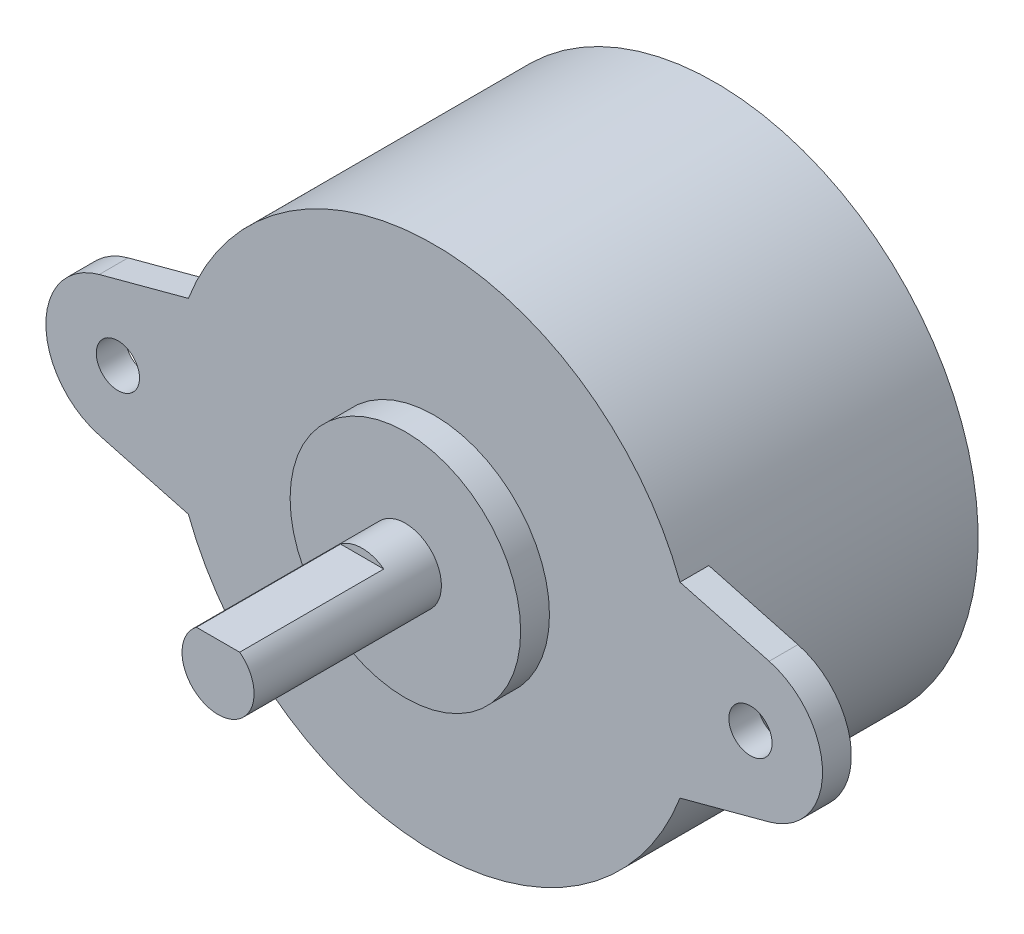
ISO-10303-21;
HEADER;
FILE_DESCRIPTION(('STEP AP214'),'2;1');
FILE_NAME('part.step','',(''),(''),'','','');
FILE_SCHEMA(('AUTOMOTIVE_DESIGN { 1 0 10303 214 1 1 1 1 }'));
ENDSEC;
DATA;
#1=APPLICATION_CONTEXT('core data for automotive mechanical design processes');
#2=APPLICATION_PROTOCOL_DEFINITION('international standard','automotive_design',2000,#1);
#3=PRODUCT_CONTEXT('',#1,'mechanical');
#4=PRODUCT('Part','Part','',(#3));
#5=PRODUCT_RELATED_PRODUCT_CATEGORY('part','',(#4));
#6=PRODUCT_DEFINITION_FORMATION('','',#4);
#7=PRODUCT_DEFINITION_CONTEXT('part definition',#1,'design');
#8=PRODUCT_DEFINITION('design','',#6,#7);
#9=PRODUCT_DEFINITION_SHAPE('','',#8);
#10=(LENGTH_UNIT() NAMED_UNIT(*) SI_UNIT(.MILLI.,.METRE.));
#11=(NAMED_UNIT(*) PLANE_ANGLE_UNIT() SI_UNIT($,.RADIAN.));
#12=(NAMED_UNIT(*) SI_UNIT($,.STERADIAN.) SOLID_ANGLE_UNIT());
#13=UNCERTAINTY_MEASURE_WITH_UNIT(LENGTH_MEASURE(1.E-05),#10,'distance_accuracy_value','');
#14=(GEOMETRIC_REPRESENTATION_CONTEXT(3) GLOBAL_UNCERTAINTY_ASSIGNED_CONTEXT((#13)) GLOBAL_UNIT_ASSIGNED_CONTEXT((#10,
#11,#12)) REPRESENTATION_CONTEXT('',''));
#15=CARTESIAN_POINT('',(0.,0.,0.));
#16=DIRECTION('',(0.,0.,1.));
#17=DIRECTION('',(1.,0.,0.));
#18=AXIS2_PLACEMENT_3D('',#15,#16,#17);
#19=CARTESIAN_POINT('',(0.,0.,-2.));
#20=DIRECTION('',(0.,0.,1.));
#21=DIRECTION('',(1.,0.,0.));
#22=AXIS2_PLACEMENT_3D('',#19,#20,#21);
#23=PLANE('',#22);
#24=CARTESIAN_POINT('',(0.,0.,-2.));
#25=DIRECTION('',(0.,0.,-1.));
#26=DIRECTION('',(-1.,0.,0.));
#27=AXIS2_PLACEMENT_3D('',#24,#25,#26);
#28=CIRCLE('',#27,18.25);
#29=CARTESIAN_POINT('',(17.058114991301,6.4871575395972,-2.));
#30=VERTEX_POINT('',#29);
#31=CARTESIAN_POINT('',(17.058114991301,-6.48715753959718,-2.));
#32=VERTEX_POINT('',#31);
#33=EDGE_CURVE('E41',#30,#32,#28,.T.);
#34=ORIENTED_EDGE('',*,*,#33,.F.);
#35=DIRECTION('',(-0.96592582628907,0.258819045102514,0.));
#36=VECTOR('',#35,1.);
#37=CARTESIAN_POINT('',(23.2440952255126,4.82962913144536,-2.));
#38=LINE('',#37,#36);
#39=CARTESIAN_POINT('',(23.2440952255126,4.82962913144536,-2.));
#40=VERTEX_POINT('',#39);
#41=EDGE_CURVE('E135',#40,#30,#38,.T.);
#42=ORIENTED_EDGE('',*,*,#41,.F.);
#43=CARTESIAN_POINT('',(21.95,0.,-2.));
#44=DIRECTION('',(0.,0.,1.));
#45=DIRECTION('',(1.,0.,0.));
#46=AXIS2_PLACEMENT_3D('',#43,#44,#45);
#47=CIRCLE('',#46,5.);
#48=CARTESIAN_POINT('',(23.2440952255126,-4.82962913144534,-2.));
#49=VERTEX_POINT('',#48);
#50=EDGE_CURVE('E138',#49,#40,#47,.T.);
#51=ORIENTED_EDGE('',*,*,#50,.F.);
#52=DIRECTION('',(0.96592582628907,0.258819045102515,0.));
#53=VECTOR('',#52,1.);
#54=CARTESIAN_POINT('',(23.2440952255126,-4.82962913144534,-2.));
#55=LINE('',#54,#53);
#56=EDGE_CURVE('E165',#32,#49,#55,.T.);
#57=ORIENTED_EDGE('',*,*,#56,.F.);
#58=EDGE_LOOP('',(#34,#42,#51,#57));
#59=FACE_BOUND('',#58,.T.);
#60=CARTESIAN_POINT('',(21.95,0.,-2.));
#61=DIRECTION('',(0.,0.,1.));
#62=DIRECTION('',(1.,0.,0.));
#63=AXIS2_PLACEMENT_3D('',#60,#61,#62);
#64=CIRCLE('',#63,1.5);
#65=CARTESIAN_POINT('',(23.45,0.,-2.));
#66=VERTEX_POINT('',#65);
#67=EDGE_CURVE('E217',#66,#66,#64,.T.);
#68=ORIENTED_EDGE('',*,*,#67,.T.);
#69=EDGE_LOOP('',(#68));
#70=FACE_BOUND('',#69,.T.);
#71=ADVANCED_FACE('F32',(#59,#70),#23,.F.);
#72=CARTESIAN_POINT('',(-23.2440952255126,-4.82962913144534,-2.));
#73=DIRECTION('',(-0.258819045102521,-0.965925826289068,0.));
#74=DIRECTION('',(0.965925826289068,-0.258819045102521,0.));
#75=AXIS2_PLACEMENT_3D('',#72,#73,#74);
#76=PLANE('',#75);
#77=DIRECTION('',(0.965925826289068,-0.258819045102521,0.));
#78=VECTOR('',#77,1.);
#79=CARTESIAN_POINT('',(-23.2440952255126,-4.82962913144534,0.));
#80=LINE('',#79,#78);
#81=CARTESIAN_POINT('',(-23.2440952255126,-4.82962913144534,0.));
#82=VERTEX_POINT('',#81);
#83=CARTESIAN_POINT('',(-17.058114991301,-6.48715753959724,0.));
#84=VERTEX_POINT('',#83);
#85=EDGE_CURVE('E162',#82,#84,#80,.T.);
#86=ORIENTED_EDGE('',*,*,#85,.F.);
#87=DIRECTION('',(0.,0.,1.));
#88=VECTOR('',#87,1.);
#89=CARTESIAN_POINT('',(-23.2440952255126,-4.82962913144534,-2.));
#90=LINE('',#89,#88);
#91=CARTESIAN_POINT('',(-23.2440952255126,-4.82962913144534,-2.));
#92=VERTEX_POINT('',#91);
#93=EDGE_CURVE('E125',#92,#82,#90,.T.);
#94=ORIENTED_EDGE('',*,*,#93,.F.);
#95=DIRECTION('',(0.965925826289068,-0.258819045102521,0.));
#96=VECTOR('',#95,1.);
#97=CARTESIAN_POINT('',(-23.2440952255126,-4.82962913144534,-2.));
#98=LINE('',#97,#96);
#99=CARTESIAN_POINT('',(-17.058114991301,-6.48715753959724,-2.));
#100=VERTEX_POINT('',#99);
#101=EDGE_CURVE('E132',#92,#100,#98,.T.);
#102=ORIENTED_EDGE('',*,*,#101,.T.);
#103=DIRECTION('',(0.,0.,1.));
#104=VECTOR('',#103,1.);
#105=CARTESIAN_POINT('',(-17.058114991301,-6.48715753959724,-2.));
#106=LINE('',#105,#104);
#107=EDGE_CURVE('E92',#100,#84,#106,.T.);
#108=ORIENTED_EDGE('',*,*,#107,.T.);
#109=EDGE_LOOP('',(#86,#94,#102,#108));
#110=FACE_BOUND('',#109,.T.);
#111=ADVANCED_FACE('F182',(#110),#76,.T.);
#112=CARTESIAN_POINT('',(-21.95,0.,-2.));
#113=DIRECTION('',(0.,0.,1.));
#114=DIRECTION('',(1.,0.,0.));
#115=AXIS2_PLACEMENT_3D('',#112,#113,#114);
#116=CYLINDRICAL_SURFACE('',#115,5.);
#117=CARTESIAN_POINT('',(-21.95,0.,0.));
#118=DIRECTION('',(0.,0.,1.));
#119=DIRECTION('',(1.,0.,0.));
#120=AXIS2_PLACEMENT_3D('',#117,#118,#119);
#121=CIRCLE('',#120,5.);
#122=CARTESIAN_POINT('',(-23.2440952255126,4.82962913144534,0.));
#123=VERTEX_POINT('',#122);
#124=EDGE_CURVE('E120',#123,#82,#121,.T.);
#125=ORIENTED_EDGE('',*,*,#124,.F.);
#126=DIRECTION('',(0.,0.,1.));
#127=VECTOR('',#126,1.);
#128=CARTESIAN_POINT('',(-23.2440952255126,4.82962913144534,-2.));
#129=LINE('',#128,#127);
#130=CARTESIAN_POINT('',(-23.2440952255126,4.82962913144534,-2.));
#131=VERTEX_POINT('',#130);
#132=EDGE_CURVE('E115',#131,#123,#129,.T.);
#133=ORIENTED_EDGE('',*,*,#132,.F.);
#134=CARTESIAN_POINT('',(-21.95,0.,-2.));
#135=DIRECTION('',(0.,0.,1.));
#136=DIRECTION('',(1.,0.,0.));
#137=AXIS2_PLACEMENT_3D('',#134,#135,#136);
#138=CIRCLE('',#137,5.);
#139=EDGE_CURVE('E118',#131,#92,#138,.T.);
#140=ORIENTED_EDGE('',*,*,#139,.T.);
#141=ORIENTED_EDGE('',*,*,#93,.T.);
#142=EDGE_LOOP('',(#125,#133,#140,#141));
#143=FACE_BOUND('',#142,.T.);
#144=ADVANCED_FACE('F117',(#143),#116,.T.);
#145=CARTESIAN_POINT('',(-23.2440952255126,4.82962913144534,-2.));
#146=DIRECTION('',(-0.258819045102522,0.965925826289068,0.));
#147=DIRECTION('',(-0.965925826289068,-0.258819045102522,0.));
#148=AXIS2_PLACEMENT_3D('',#145,#146,#147);
#149=PLANE('',#148);
#150=DIRECTION('',(-0.965925826289068,-0.258819045102522,0.));
#151=VECTOR('',#150,1.);
#152=CARTESIAN_POINT('',(-23.2440952255126,4.82962913144534,0.));
#153=LINE('',#152,#151);
#154=CARTESIAN_POINT('',(-17.058114991301,6.48715753959725,0.));
#155=VERTEX_POINT('',#154);
#156=EDGE_CURVE('E159',#155,#123,#153,.T.);
#157=ORIENTED_EDGE('',*,*,#156,.F.);
#158=DIRECTION('',(0.,0.,1.));
#159=VECTOR('',#158,1.);
#160=CARTESIAN_POINT('',(-17.058114991301,6.48715753959725,-2.));
#161=LINE('',#160,#159);
#162=CARTESIAN_POINT('',(-17.058114991301,6.48715753959724,-2.));
#163=VERTEX_POINT('',#162);
#164=EDGE_CURVE('E126',#163,#155,#161,.T.);
#165=ORIENTED_EDGE('',*,*,#164,.F.);
#166=DIRECTION('',(-0.965925826289068,-0.258819045102522,0.));
#167=VECTOR('',#166,1.);
#168=CARTESIAN_POINT('',(-23.2440952255126,4.82962913144534,-2.));
#169=LINE('',#168,#167);
#170=EDGE_CURVE('E130',#163,#131,#169,.T.);
#171=ORIENTED_EDGE('',*,*,#170,.T.);
#172=ORIENTED_EDGE('',*,*,#132,.T.);
#173=EDGE_LOOP('',(#157,#165,#171,#172));
#174=FACE_BOUND('',#173,.T.);
#175=ADVANCED_FACE('F134',(#174),#149,.T.);
#176=CARTESIAN_POINT('',(0.,0.,-2.));
#177=DIRECTION('',(0.,0.,1.));
#178=DIRECTION('',(1.,0.,0.));
#179=AXIS2_PLACEMENT_3D('',#176,#177,#178);
#180=CYLINDRICAL_SURFACE('',#179,18.25);
#181=CARTESIAN_POINT('',(0.,0.,0.));
#182=DIRECTION('',(0.,0.,1.));
#183=DIRECTION('',(1.,0.,0.));
#184=AXIS2_PLACEMENT_3D('',#181,#182,#183);
#185=CIRCLE('',#184,18.25);
#186=CARTESIAN_POINT('',(17.058114991301,6.4871575395972,0.));
#187=VERTEX_POINT('',#186);
#188=EDGE_CURVE('E156',#187,#155,#185,.T.);
#189=ORIENTED_EDGE('',*,*,#188,.F.);
#190=DIRECTION('',(0.,0.,1.));
#191=VECTOR('',#190,1.);
#192=CARTESIAN_POINT('',(17.058114991301,6.4871575395972,-2.));
#193=LINE('',#192,#191);
#194=EDGE_CURVE('E169',#30,#187,#193,.T.);
#195=ORIENTED_EDGE('',*,*,#194,.F.);
#196=ORIENTED_EDGE('',*,*,#33,.T.);
#197=DIRECTION('',(0.,0.,1.));
#198=VECTOR('',#197,1.);
#199=CARTESIAN_POINT('',(17.058114991301,-6.48715753959718,-2.));
#200=LINE('',#199,#198);
#201=CARTESIAN_POINT('',(17.058114991301,-6.48715753959718,0.));
#202=VERTEX_POINT('',#201);
#203=EDGE_CURVE('E36',#32,#202,#200,.T.);
#204=ORIENTED_EDGE('',*,*,#203,.T.);
#205=CARTESIAN_POINT('',(0.,0.,0.));
#206=DIRECTION('',(0.,0.,1.));
#207=DIRECTION('',(1.,0.,0.));
#208=AXIS2_PLACEMENT_3D('',#205,#206,#207);
#209=CIRCLE('',#208,18.25);
#210=EDGE_CURVE('E143',#84,#202,#209,.T.);
#211=ORIENTED_EDGE('',*,*,#210,.F.);
#212=ORIENTED_EDGE('',*,*,#107,.F.);
#213=EDGE_CURVE('E58',#100,#163,#28,.T.);
#214=ORIENTED_EDGE('',*,*,#213,.T.);
#215=ORIENTED_EDGE('',*,*,#164,.T.);
#216=EDGE_LOOP('',(#189,#195,#196,#204,#211,#212,#214,#215));
#217=FACE_BOUND('',#216,.T.);
#218=CARTESIAN_POINT('',(0.,0.,-19.5));
#219=DIRECTION('',(0.,0.,-1.));
#220=DIRECTION('',(-1.,0.,0.));
#221=AXIS2_PLACEMENT_3D('',#218,#219,#220);
#222=CIRCLE('',#221,18.25);
#223=CARTESIAN_POINT('',(-18.25,0.,-19.5));
#224=VERTEX_POINT('',#223);
#225=EDGE_CURVE('E215',#224,#224,#222,.T.);
#226=ORIENTED_EDGE('',*,*,#225,.F.);
#227=EDGE_LOOP('',(#226));
#228=FACE_BOUND('',#227,.T.);
#229=ADVANCED_FACE('F177',(#217,#228),#180,.T.);
#230=CARTESIAN_POINT('',(23.2440952255126,4.82962913144536,-2.));
#231=DIRECTION('',(0.258819045102514,0.96592582628907,0.));
#232=DIRECTION('',(-0.96592582628907,0.258819045102514,0.));
#233=AXIS2_PLACEMENT_3D('',#230,#231,#232);
#234=PLANE('',#233);
#235=DIRECTION('',(-0.96592582628907,0.258819045102514,0.));
#236=VECTOR('',#235,1.);
#237=CARTESIAN_POINT('',(23.2440952255126,4.82962913144536,0.));
#238=LINE('',#237,#236);
#239=CARTESIAN_POINT('',(23.2440952255126,4.82962913144536,0.));
#240=VERTEX_POINT('',#239);
#241=EDGE_CURVE('E153',#240,#187,#238,.T.);
#242=ORIENTED_EDGE('',*,*,#241,.F.);
#243=DIRECTION('',(0.,0.,1.));
#244=VECTOR('',#243,1.);
#245=CARTESIAN_POINT('',(23.2440952255126,4.82962913144536,-2.));
#246=LINE('',#245,#244);
#247=EDGE_CURVE('E171',#40,#240,#246,.T.);
#248=ORIENTED_EDGE('',*,*,#247,.F.);
#249=ORIENTED_EDGE('',*,*,#41,.T.);
#250=ORIENTED_EDGE('',*,*,#194,.T.);
#251=EDGE_LOOP('',(#242,#248,#249,#250));
#252=FACE_BOUND('',#251,.T.);
#253=ADVANCED_FACE('F198',(#252),#234,.T.);
#254=CARTESIAN_POINT('',(21.95,0.,-2.));
#255=DIRECTION('',(0.,0.,1.));
#256=DIRECTION('',(1.,0.,0.));
#257=AXIS2_PLACEMENT_3D('',#254,#255,#256);
#258=CYLINDRICAL_SURFACE('',#257,5.);
#259=CARTESIAN_POINT('',(21.95,0.,0.));
#260=DIRECTION('',(0.,0.,1.));
#261=DIRECTION('',(1.,0.,0.));
#262=AXIS2_PLACEMENT_3D('',#259,#260,#261);
#263=CIRCLE('',#262,5.);
#264=CARTESIAN_POINT('',(23.2440952255126,-4.82962913144534,0.));
#265=VERTEX_POINT('',#264);
#266=EDGE_CURVE('E150',#265,#240,#263,.T.);
#267=ORIENTED_EDGE('',*,*,#266,.F.);
#268=DIRECTION('',(0.,0.,1.));
#269=VECTOR('',#268,1.);
#270=CARTESIAN_POINT('',(23.2440952255126,-4.82962913144534,-2.));
#271=LINE('',#270,#269);
#272=EDGE_CURVE('E172',#49,#265,#271,.T.);
#273=ORIENTED_EDGE('',*,*,#272,.F.);
#274=ORIENTED_EDGE('',*,*,#50,.T.);
#275=ORIENTED_EDGE('',*,*,#247,.T.);
#276=EDGE_LOOP('',(#267,#273,#274,#275));
#277=FACE_BOUND('',#276,.T.);
#278=ADVANCED_FACE('F200',(#277),#258,.T.);
#279=CARTESIAN_POINT('',(23.2440952255126,-4.82962913144534,-2.));
#280=DIRECTION('',(0.258819045102515,-0.96592582628907,0.));
#281=DIRECTION('',(0.96592582628907,0.258819045102515,0.));
#282=AXIS2_PLACEMENT_3D('',#279,#280,#281);
#283=PLANE('',#282);
#284=DIRECTION('',(0.96592582628907,0.258819045102515,0.));
#285=VECTOR('',#284,1.);
#286=CARTESIAN_POINT('',(23.2440952255126,-4.82962913144534,0.));
#287=LINE('',#286,#285);
#288=EDGE_CURVE('E146',#202,#265,#287,.T.);
#289=ORIENTED_EDGE('',*,*,#288,.F.);
#290=ORIENTED_EDGE('',*,*,#203,.F.);
#291=ORIENTED_EDGE('',*,*,#56,.T.);
#292=ORIENTED_EDGE('',*,*,#272,.T.);
#293=EDGE_LOOP('',(#289,#290,#291,#292));
#294=FACE_BOUND('',#293,.T.);
#295=ADVANCED_FACE('F34',(#294),#283,.T.);
#296=ORIENTED_EDGE('',*,*,#213,.F.);
#297=ORIENTED_EDGE('',*,*,#101,.F.);
#298=ORIENTED_EDGE('',*,*,#139,.F.);
#299=ORIENTED_EDGE('',*,*,#170,.F.);
#300=EDGE_LOOP('',(#296,#297,#298,#299));
#301=FACE_BOUND('',#300,.T.);
#302=CARTESIAN_POINT('',(-21.95,0.,-2.));
#303=DIRECTION('',(0.,0.,1.));
#304=DIRECTION('',(1.,0.,0.));
#305=AXIS2_PLACEMENT_3D('',#302,#303,#304);
#306=CIRCLE('',#305,1.5);
#307=CARTESIAN_POINT('',(-20.45,0.,-2.));
#308=VERTEX_POINT('',#307);
#309=EDGE_CURVE('E147',#308,#308,#306,.T.);
#310=ORIENTED_EDGE('',*,*,#309,.T.);
#311=EDGE_LOOP('',(#310));
#312=FACE_BOUND('',#311,.T.);
#313=ADVANCED_FACE('F128',(#301,#312),#23,.F.);
#314=CARTESIAN_POINT('',(0.,0.,0.));
#315=DIRECTION('',(0.,0.,1.));
#316=DIRECTION('',(1.,0.,0.));
#317=AXIS2_PLACEMENT_3D('',#314,#315,#316);
#318=PLANE('',#317);
#319=CARTESIAN_POINT('',(0.,0.,0.));
#320=DIRECTION('',(0.,0.,1.));
#321=DIRECTION('',(1.,0.,0.));
#322=AXIS2_PLACEMENT_3D('',#319,#320,#321);
#323=CIRCLE('',#322,8.);
#324=CARTESIAN_POINT('',(8.,0.,0.));
#325=VERTEX_POINT('',#324);
#326=EDGE_CURVE('E335',#325,#325,#323,.T.);
#327=ORIENTED_EDGE('',*,*,#326,.F.);
#328=EDGE_LOOP('',(#327));
#329=FACE_BOUND('',#328,.T.);
#330=CARTESIAN_POINT('',(21.95,0.,0.));
#331=DIRECTION('',(0.,0.,1.));
#332=DIRECTION('',(1.,0.,0.));
#333=AXIS2_PLACEMENT_3D('',#330,#331,#332);
#334=CIRCLE('',#333,1.5);
#335=CARTESIAN_POINT('',(23.45,0.,0.));
#336=VERTEX_POINT('',#335);
#337=EDGE_CURVE('E221',#336,#336,#334,.T.);
#338=ORIENTED_EDGE('',*,*,#337,.F.);
#339=EDGE_LOOP('',(#338));
#340=FACE_BOUND('',#339,.T.);
#341=CARTESIAN_POINT('',(-21.95,0.,0.));
#342=DIRECTION('',(0.,0.,1.));
#343=DIRECTION('',(1.,0.,0.));
#344=AXIS2_PLACEMENT_3D('',#341,#342,#343);
#345=CIRCLE('',#344,1.5);
#346=CARTESIAN_POINT('',(-20.45,0.,0.));
#347=VERTEX_POINT('',#346);
#348=EDGE_CURVE('E220',#347,#347,#345,.T.);
#349=ORIENTED_EDGE('',*,*,#348,.F.);
#350=EDGE_LOOP('',(#349));
#351=FACE_BOUND('',#350,.T.);
#352=ORIENTED_EDGE('',*,*,#210,.T.);
#353=ORIENTED_EDGE('',*,*,#288,.T.);
#354=ORIENTED_EDGE('',*,*,#266,.T.);
#355=ORIENTED_EDGE('',*,*,#241,.T.);
#356=ORIENTED_EDGE('',*,*,#188,.T.);
#357=ORIENTED_EDGE('',*,*,#156,.T.);
#358=ORIENTED_EDGE('',*,*,#124,.T.);
#359=ORIENTED_EDGE('',*,*,#85,.T.);
#360=EDGE_LOOP('',(#352,#353,#354,#355,#356,#357,#358,#359));
#361=FACE_BOUND('',#360,.T.);
#362=ADVANCED_FACE('F181',(#329,#340,#351,#361),#318,.T.);
#363=CARTESIAN_POINT('',(-21.95,0.,-2.));
#364=DIRECTION('',(0.,0.,1.));
#365=DIRECTION('',(1.,0.,0.));
#366=AXIS2_PLACEMENT_3D('',#363,#364,#365);
#367=CYLINDRICAL_SURFACE('',#366,1.5);
#368=ORIENTED_EDGE('',*,*,#309,.F.);
#369=EDGE_LOOP('',(#368));
#370=FACE_BOUND('',#369,.T.);
#371=ORIENTED_EDGE('',*,*,#348,.T.);
#372=EDGE_LOOP('',(#371));
#373=FACE_BOUND('',#372,.T.);
#374=ADVANCED_FACE('F235',(#370,#373),#367,.F.);
#375=CARTESIAN_POINT('',(21.95,0.,-2.));
#376=DIRECTION('',(0.,0.,1.));
#377=DIRECTION('',(1.,0.,0.));
#378=AXIS2_PLACEMENT_3D('',#375,#376,#377);
#379=CYLINDRICAL_SURFACE('',#378,1.5);
#380=ORIENTED_EDGE('',*,*,#67,.F.);
#381=EDGE_LOOP('',(#380));
#382=FACE_BOUND('',#381,.T.);
#383=ORIENTED_EDGE('',*,*,#337,.T.);
#384=EDGE_LOOP('',(#383));
#385=FACE_BOUND('',#384,.T.);
#386=ADVANCED_FACE('F231',(#382,#385),#379,.F.);
#387=CARTESIAN_POINT('',(0.,0.,-19.5));
#388=DIRECTION('',(0.,0.,-1.));
#389=DIRECTION('',(-1.,0.,0.));
#390=AXIS2_PLACEMENT_3D('',#387,#388,#389);
#391=PLANE('',#390);
#392=ORIENTED_EDGE('',*,*,#225,.T.);
#393=EDGE_LOOP('',(#392));
#394=FACE_BOUND('',#393,.T.);
#395=ADVANCED_FACE('F234',(#394),#391,.T.);
#396=CARTESIAN_POINT('',(0.,0.,2.));
#397=DIRECTION('',(0.,0.,-1.));
#398=DIRECTION('',(-1.,0.,0.));
#399=AXIS2_PLACEMENT_3D('',#396,#397,#398);
#400=CYLINDRICAL_SURFACE('',#399,8.);
#401=CARTESIAN_POINT('',(0.,0.,2.));
#402=DIRECTION('',(0.,0.,1.));
#403=DIRECTION('',(1.,0.,0.));
#404=AXIS2_PLACEMENT_3D('',#401,#402,#403);
#405=CIRCLE('',#404,8.);
#406=CARTESIAN_POINT('',(8.,0.,2.));
#407=VERTEX_POINT('',#406);
#408=EDGE_CURVE('E333',#407,#407,#405,.T.);
#409=ORIENTED_EDGE('',*,*,#408,.F.);
#410=EDGE_LOOP('',(#409));
#411=FACE_BOUND('',#410,.T.);
#412=ORIENTED_EDGE('',*,*,#326,.T.);
#413=EDGE_LOOP('',(#412));
#414=FACE_BOUND('',#413,.T.);
#415=ADVANCED_FACE('F270',(#411,#414),#400,.T.);
#416=CARTESIAN_POINT('',(0.,0.,2.));
#417=DIRECTION('',(0.,0.,1.));
#418=DIRECTION('',(1.,0.,0.));
#419=AXIS2_PLACEMENT_3D('',#416,#417,#418);
#420=PLANE('',#419);
#421=CARTESIAN_POINT('',(0.,0.,2.));
#422=DIRECTION('',(0.,0.,1.));
#423=DIRECTION('',(1.,0.,0.));
#424=AXIS2_PLACEMENT_3D('',#421,#422,#423);
#425=CIRCLE('',#424,2.5);
#426=CARTESIAN_POINT('',(2.5,0.,2.));
#427=VERTEX_POINT('',#426);
#428=EDGE_CURVE('E11',#427,#427,#425,.T.);
#429=ORIENTED_EDGE('',*,*,#428,.F.);
#430=EDGE_LOOP('',(#429));
#431=FACE_BOUND('',#430,.T.);
#432=ORIENTED_EDGE('',*,*,#408,.T.);
#433=EDGE_LOOP('',(#432));
#434=FACE_BOUND('',#433,.T.);
#435=ADVANCED_FACE('F275',(#431,#434),#420,.T.);
#436=CARTESIAN_POINT('',(0.,0.,15.));
#437=DIRECTION('',(0.,0.,-1.));
#438=DIRECTION('',(-1.,0.,0.));
#439=AXIS2_PLACEMENT_3D('',#436,#437,#438);
#440=CYLINDRICAL_SURFACE('',#439,2.5);
#441=CARTESIAN_POINT('',(0.,0.,15.));
#442=DIRECTION('',(0.,0.,1.));
#443=DIRECTION('',(1.,0.,0.));
#444=AXIS2_PLACEMENT_3D('',#441,#442,#443);
#445=CIRCLE('',#444,2.5);
#446=CARTESIAN_POINT('',(-1.5,2.,15.));
#447=VERTEX_POINT('',#446);
#448=CARTESIAN_POINT('',(1.5,2.,15.));
#449=VERTEX_POINT('',#448);
#450=EDGE_CURVE('E340',#447,#449,#445,.T.);
#451=ORIENTED_EDGE('',*,*,#450,.F.);
#452=DIRECTION('',(0.,0.,1.));
#453=VECTOR('',#452,1.);
#454=CARTESIAN_POINT('',(-1.5,2.,5.));
#455=LINE('',#454,#453);
#456=CARTESIAN_POINT('',(-1.5,2.,5.));
#457=VERTEX_POINT('',#456);
#458=EDGE_CURVE('E49',#457,#447,#455,.T.);
#459=ORIENTED_EDGE('',*,*,#458,.F.);
#460=CARTESIAN_POINT('',(0.,0.,5.));
#461=DIRECTION('',(0.,0.,1.));
#462=DIRECTION('',(1.,0.,0.));
#463=AXIS2_PLACEMENT_3D('',#460,#461,#462);
#464=CIRCLE('',#463,2.5);
#465=CARTESIAN_POINT('',(1.5,2.,5.));
#466=VERTEX_POINT('',#465);
#467=EDGE_CURVE('E351',#466,#457,#464,.T.);
#468=ORIENTED_EDGE('',*,*,#467,.F.);
#469=DIRECTION('',(0.,0.,1.));
#470=VECTOR('',#469,1.);
#471=CARTESIAN_POINT('',(1.5,2.,5.));
#472=LINE('',#471,#470);
#473=EDGE_CURVE('E344',#466,#449,#472,.T.);
#474=ORIENTED_EDGE('',*,*,#473,.T.);
#475=EDGE_LOOP('',(#451,#459,#468,#474));
#476=FACE_BOUND('',#475,.T.);
#477=ORIENTED_EDGE('',*,*,#428,.T.);
#478=EDGE_LOOP('',(#477));
#479=FACE_BOUND('',#478,.T.);
#480=ADVANCED_FACE('F285',(#476,#479),#440,.T.);
#481=CARTESIAN_POINT('',(0.,0.,15.));
#482=DIRECTION('',(0.,0.,1.));
#483=DIRECTION('',(1.,0.,0.));
#484=AXIS2_PLACEMENT_3D('',#481,#482,#483);
#485=PLANE('',#484);
#486=DIRECTION('',(1.,0.,0.));
#487=VECTOR('',#486,1.);
#488=CARTESIAN_POINT('',(1.5,2.,15.));
#489=LINE('',#488,#487);
#490=EDGE_CURVE('E349',#447,#449,#489,.T.);
#491=ORIENTED_EDGE('',*,*,#490,.F.);
#492=ORIENTED_EDGE('',*,*,#450,.T.);
#493=EDGE_LOOP('',(#491,#492));
#494=FACE_BOUND('',#493,.T.);
#495=ADVANCED_FACE('F295',(#494),#485,.T.);
#496=CARTESIAN_POINT('',(1.5,2.,5.));
#497=DIRECTION('',(0.,-1.,0.));
#498=DIRECTION('',(0.,0.,-1.));
#499=AXIS2_PLACEMENT_3D('',#496,#497,#498);
#500=PLANE('',#499);
#501=ORIENTED_EDGE('',*,*,#490,.T.);
#502=ORIENTED_EDGE('',*,*,#473,.F.);
#503=DIRECTION('',(1.,0.,0.));
#504=VECTOR('',#503,1.);
#505=CARTESIAN_POINT('',(1.5,2.,5.));
#506=LINE('',#505,#504);
#507=EDGE_CURVE('E346',#457,#466,#506,.T.);
#508=ORIENTED_EDGE('',*,*,#507,.F.);
#509=ORIENTED_EDGE('',*,*,#458,.T.);
#510=EDGE_LOOP('',(#501,#502,#508,#509));
#511=FACE_BOUND('',#510,.T.);
#512=ADVANCED_FACE('F305',(#511),#500,.F.);
#513=CARTESIAN_POINT('',(0.,0.,5.));
#514=DIRECTION('',(0.,0.,1.));
#515=DIRECTION('',(1.,0.,0.));
#516=AXIS2_PLACEMENT_3D('',#513,#514,#515);
#517=PLANE('',#516);
#518=ORIENTED_EDGE('',*,*,#467,.T.);
#519=ORIENTED_EDGE('',*,*,#507,.T.);
#520=EDGE_LOOP('',(#518,#519));
#521=FACE_BOUND('',#520,.T.);
#522=ADVANCED_FACE('F315',(#521),#517,.T.);
#523=CLOSED_SHELL('',(#71,#111,#144,#175,#229,#253,#278,#295,#313,#362,#374,#386,#395,#415,#435,
#480,#495,#512,#522));
#524=MANIFOLD_SOLID_BREP('B2',#523);
#525=ADVANCED_BREP_SHAPE_REPRESENTATION('',(#18,#524),#14);
#526=SHAPE_DEFINITION_REPRESENTATION(#9,#525);
ENDSEC;
END-ISO-10303-21;
